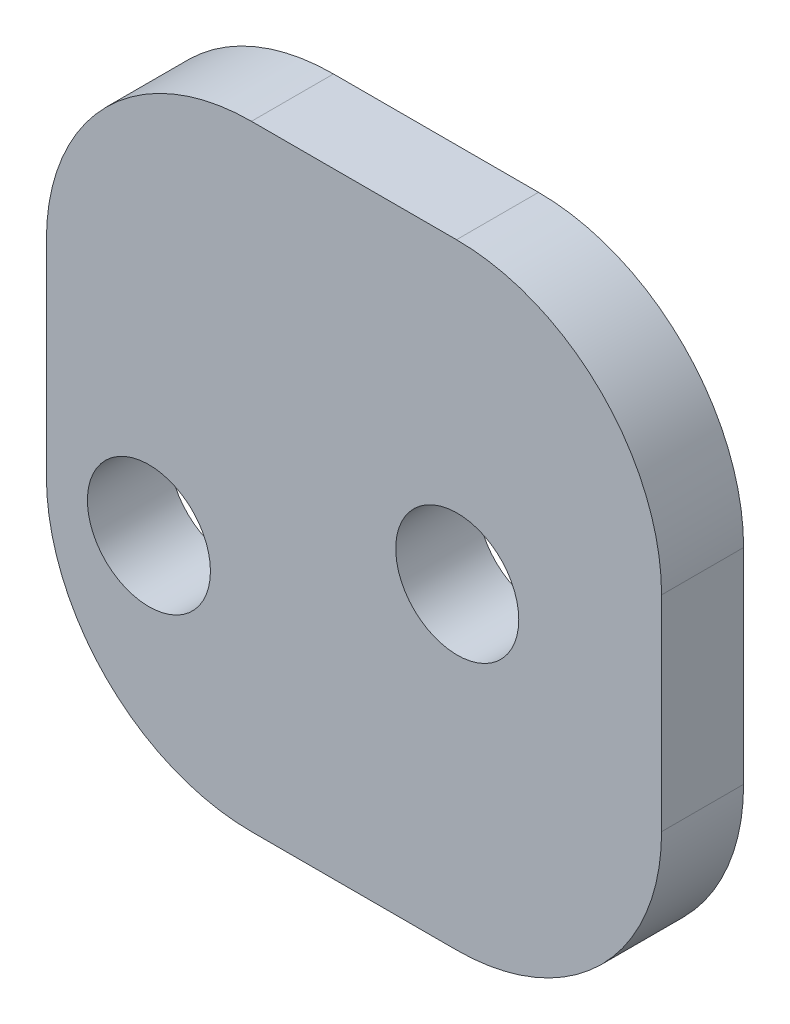
ISO-10303-21;
HEADER;
FILE_DESCRIPTION(('STEP AP214'),'2;1');
FILE_NAME('part.step','',(''),(''),'','','');
FILE_SCHEMA(('AUTOMOTIVE_DESIGN { 1 0 10303 214 1 1 1 1 }'));
ENDSEC;
DATA;
#1=APPLICATION_CONTEXT('core data for automotive mechanical design processes');
#2=APPLICATION_PROTOCOL_DEFINITION('international standard','automotive_design',2000,#1);
#3=PRODUCT_CONTEXT('',#1,'mechanical');
#4=PRODUCT('Part','Part','',(#3));
#5=PRODUCT_RELATED_PRODUCT_CATEGORY('part','',(#4));
#6=PRODUCT_DEFINITION_FORMATION('','',#4);
#7=PRODUCT_DEFINITION_CONTEXT('part definition',#1,'design');
#8=PRODUCT_DEFINITION('design','',#6,#7);
#9=PRODUCT_DEFINITION_SHAPE('','',#8);
#10=(LENGTH_UNIT() NAMED_UNIT(*) SI_UNIT(.MILLI.,.METRE.));
#11=(NAMED_UNIT(*) PLANE_ANGLE_UNIT() SI_UNIT($,.RADIAN.));
#12=(NAMED_UNIT(*) SI_UNIT($,.STERADIAN.) SOLID_ANGLE_UNIT());
#13=UNCERTAINTY_MEASURE_WITH_UNIT(LENGTH_MEASURE(1.E-05),#10,'distance_accuracy_value','');
#14=(GEOMETRIC_REPRESENTATION_CONTEXT(3) GLOBAL_UNCERTAINTY_ASSIGNED_CONTEXT((#13)) GLOBAL_UNIT_ASSIGNED_CONTEXT((#10,
#11,#12)) REPRESENTATION_CONTEXT('',''));
#15=CARTESIAN_POINT('',(0.,0.,0.));
#16=DIRECTION('',(0.,0.,1.));
#17=DIRECTION('',(1.,0.,0.));
#18=AXIS2_PLACEMENT_3D('',#15,#16,#17);
#19=CARTESIAN_POINT('',(-20.,7.5,2.));
#20=DIRECTION('',(0.,-1.,0.));
#21=DIRECTION('',(0.,0.,-1.));
#22=AXIS2_PLACEMENT_3D('',#19,#20,#21);
#23=PLANE('',#22);
#24=DIRECTION('',(-1.,0.,0.));
#25=VECTOR('',#24,1.);
#26=CARTESIAN_POINT('',(-20.,7.5,2.));
#27=LINE('',#26,#25);
#28=CARTESIAN_POINT('',(-10.,7.5,2.));
#29=VERTEX_POINT('',#28);
#30=CARTESIAN_POINT('',(-15.,7.5,2.));
#31=VERTEX_POINT('',#30);
#32=EDGE_CURVE('E128',#29,#31,#27,.T.);
#33=ORIENTED_EDGE('',*,*,#32,.F.);
#34=DIRECTION('',(0.,0.,1.));
#35=VECTOR('',#34,1.);
#36=CARTESIAN_POINT('',(-10.,7.5,2.));
#37=LINE('',#36,#35);
#38=CARTESIAN_POINT('',(-10.,7.5,0.));
#39=VERTEX_POINT('',#38);
#40=EDGE_CURVE('E11',#29,#39,#37,.F.);
#41=ORIENTED_EDGE('',*,*,#40,.T.);
#42=DIRECTION('',(-1.,0.,0.));
#43=VECTOR('',#42,1.);
#44=CARTESIAN_POINT('',(-20.,7.5,0.));
#45=LINE('',#44,#43);
#46=CARTESIAN_POINT('',(-15.,7.5,0.));
#47=VERTEX_POINT('',#46);
#48=EDGE_CURVE('E133',#39,#47,#45,.T.);
#49=ORIENTED_EDGE('',*,*,#48,.T.);
#50=DIRECTION('',(0.,0.,-1.));
#51=VECTOR('',#50,1.);
#52=CARTESIAN_POINT('',(-15.,7.5,2.));
#53=LINE('',#52,#51);
#54=EDGE_CURVE('E42',#47,#31,#53,.F.);
#55=ORIENTED_EDGE('',*,*,#54,.T.);
#56=EDGE_LOOP('',(#33,#41,#49,#55));
#57=FACE_BOUND('',#56,.T.);
#58=ADVANCED_FACE('F34',(#57),#23,.F.);
#59=CARTESIAN_POINT('',(-20.,-7.5,2.));
#60=DIRECTION('',(1.,0.,0.));
#61=DIRECTION('',(0.,0.,-1.));
#62=AXIS2_PLACEMENT_3D('',#59,#60,#61);
#63=PLANE('',#62);
#64=DIRECTION('',(0.,-1.,0.));
#65=VECTOR('',#64,1.);
#66=CARTESIAN_POINT('',(-20.,-7.5,0.));
#67=LINE('',#66,#65);
#68=CARTESIAN_POINT('',(-20.,2.5,0.));
#69=VERTEX_POINT('',#68);
#70=CARTESIAN_POINT('',(-20.,-2.5,0.));
#71=VERTEX_POINT('',#70);
#72=EDGE_CURVE('E129',#69,#71,#67,.T.);
#73=ORIENTED_EDGE('',*,*,#72,.T.);
#74=DIRECTION('',(0.,0.,-1.));
#75=VECTOR('',#74,1.);
#76=CARTESIAN_POINT('',(-20.,-2.5,2.));
#77=LINE('',#76,#75);
#78=CARTESIAN_POINT('',(-20.,-2.5,2.));
#79=VERTEX_POINT('',#78);
#80=EDGE_CURVE('E103',#71,#79,#77,.F.);
#81=ORIENTED_EDGE('',*,*,#80,.T.);
#82=DIRECTION('',(0.,-1.,0.));
#83=VECTOR('',#82,1.);
#84=CARTESIAN_POINT('',(-20.,-7.5,2.));
#85=LINE('',#84,#83);
#86=CARTESIAN_POINT('',(-20.,2.5,2.));
#87=VERTEX_POINT('',#86);
#88=EDGE_CURVE('E131',#87,#79,#85,.T.);
#89=ORIENTED_EDGE('',*,*,#88,.F.);
#90=DIRECTION('',(0.,0.,-1.));
#91=VECTOR('',#90,1.);
#92=CARTESIAN_POINT('',(-20.,2.5,2.));
#93=LINE('',#92,#91);
#94=EDGE_CURVE('E108',#87,#69,#93,.T.);
#95=ORIENTED_EDGE('',*,*,#94,.T.);
#96=EDGE_LOOP('',(#73,#81,#89,#95));
#97=FACE_BOUND('',#96,.T.);
#98=ADVANCED_FACE('F190',(#97),#63,.F.);
#99=CARTESIAN_POINT('',(-20.,-7.5,2.));
#100=DIRECTION('',(0.,1.,0.));
#101=DIRECTION('',(0.,0.,1.));
#102=AXIS2_PLACEMENT_3D('',#99,#100,#101);
#103=PLANE('',#102);
#104=DIRECTION('',(1.,0.,0.));
#105=VECTOR('',#104,1.);
#106=CARTESIAN_POINT('',(-20.,-7.5,2.));
#107=LINE('',#106,#105);
#108=CARTESIAN_POINT('',(-15.,-7.5,2.));
#109=VERTEX_POINT('',#108);
#110=CARTESIAN_POINT('',(-10.,-7.5,2.));
#111=VERTEX_POINT('',#110);
#112=EDGE_CURVE('E119',#109,#111,#107,.T.);
#113=ORIENTED_EDGE('',*,*,#112,.F.);
#114=DIRECTION('',(0.,0.,-1.));
#115=VECTOR('',#114,1.);
#116=CARTESIAN_POINT('',(-15.,-7.5,2.));
#117=LINE('',#116,#115);
#118=CARTESIAN_POINT('',(-15.,-7.5,0.));
#119=VERTEX_POINT('',#118);
#120=EDGE_CURVE('E102',#109,#119,#117,.T.);
#121=ORIENTED_EDGE('',*,*,#120,.T.);
#122=DIRECTION('',(1.,0.,0.));
#123=VECTOR('',#122,1.);
#124=CARTESIAN_POINT('',(-20.,-7.5,0.));
#125=LINE('',#124,#123);
#126=CARTESIAN_POINT('',(-10.,-7.5,0.));
#127=VERTEX_POINT('',#126);
#128=EDGE_CURVE('E116',#119,#127,#125,.T.);
#129=ORIENTED_EDGE('',*,*,#128,.T.);
#130=DIRECTION('',(0.,0.,1.));
#131=VECTOR('',#130,1.);
#132=CARTESIAN_POINT('',(-10.,-7.5,2.));
#133=LINE('',#132,#131);
#134=EDGE_CURVE('E121',#127,#111,#133,.T.);
#135=ORIENTED_EDGE('',*,*,#134,.T.);
#136=EDGE_LOOP('',(#113,#121,#129,#135));
#137=FACE_BOUND('',#136,.T.);
#138=ADVANCED_FACE('F114',(#137),#103,.F.);
#139=CARTESIAN_POINT('',(0.,0.,2.));
#140=DIRECTION('',(0.,0.,-1.));
#141=DIRECTION('',(-1.,0.,0.));
#142=AXIS2_PLACEMENT_3D('',#139,#140,#141);
#143=PLANE('',#142);
#144=CARTESIAN_POINT('',(-17.5000000000003,-2.50000000003801,2.));
#145=DIRECTION('',(0.,0.,1.));
#146=DIRECTION('',(1.,0.,0.));
#147=AXIS2_PLACEMENT_3D('',#144,#145,#146);
#148=CIRCLE('',#147,1.5);
#149=CARTESIAN_POINT('',(-16.0000000000003,-2.50000000003801,2.));
#150=VERTEX_POINT('',#149);
#151=EDGE_CURVE('E168',#150,#150,#148,.T.);
#152=ORIENTED_EDGE('',*,*,#151,.F.);
#153=EDGE_LOOP('',(#152));
#154=FACE_BOUND('',#153,.T.);
#155=CARTESIAN_POINT('',(-9.98245903371299,0.236161146567329,2.));
#156=DIRECTION('',(0.,0.,1.));
#157=DIRECTION('',(1.,0.,0.));
#158=AXIS2_PLACEMENT_3D('',#155,#156,#157);
#159=CIRCLE('',#158,1.5);
#160=CARTESIAN_POINT('',(-8.48245903371299,0.236161146567329,2.));
#161=VERTEX_POINT('',#160);
#162=EDGE_CURVE('E175',#161,#161,#159,.T.);
#163=ORIENTED_EDGE('',*,*,#162,.F.);
#164=EDGE_LOOP('',(#163));
#165=FACE_BOUND('',#164,.T.);
#166=ORIENTED_EDGE('',*,*,#88,.T.);
#167=CARTESIAN_POINT('',(-15.,-2.5,2.));
#168=DIRECTION('',(0.,0.,-1.));
#169=DIRECTION('',(-1.,0.,0.));
#170=AXIS2_PLACEMENT_3D('',#167,#168,#169);
#171=CIRCLE('',#170,5.);
#172=EDGE_CURVE('E152',#79,#109,#171,.F.);
#173=ORIENTED_EDGE('',*,*,#172,.T.);
#174=ORIENTED_EDGE('',*,*,#112,.T.);
#175=CARTESIAN_POINT('',(-10.,-2.5,2.));
#176=DIRECTION('',(0.,0.,-1.));
#177=DIRECTION('',(-1.,0.,0.));
#178=AXIS2_PLACEMENT_3D('',#175,#176,#177);
#179=CIRCLE('',#178,5.);
#180=CARTESIAN_POINT('',(-5.,-2.5,2.));
#181=VERTEX_POINT('',#180);
#182=EDGE_CURVE('E149',#111,#181,#179,.F.);
#183=ORIENTED_EDGE('',*,*,#182,.T.);
#184=DIRECTION('',(0.,-1.,0.));
#185=VECTOR('',#184,1.);
#186=CARTESIAN_POINT('',(-5.,7.5,2.));
#187=LINE('',#186,#185);
#188=CARTESIAN_POINT('',(-5.,2.5,2.));
#189=VERTEX_POINT('',#188);
#190=EDGE_CURVE('E162',#189,#181,#187,.T.);
#191=ORIENTED_EDGE('',*,*,#190,.F.);
#192=CARTESIAN_POINT('',(-10.,2.5,2.));
#193=DIRECTION('',(0.,0.,-1.));
#194=DIRECTION('',(-1.,0.,0.));
#195=AXIS2_PLACEMENT_3D('',#192,#193,#194);
#196=CIRCLE('',#195,5.);
#197=EDGE_CURVE('E55',#189,#29,#196,.F.);
#198=ORIENTED_EDGE('',*,*,#197,.T.);
#199=ORIENTED_EDGE('',*,*,#32,.T.);
#200=CARTESIAN_POINT('',(-15.,2.5,2.));
#201=DIRECTION('',(0.,0.,-1.));
#202=DIRECTION('',(-1.,0.,0.));
#203=AXIS2_PLACEMENT_3D('',#200,#201,#202);
#204=CIRCLE('',#203,5.);
#205=EDGE_CURVE('E147',#31,#87,#204,.F.);
#206=ORIENTED_EDGE('',*,*,#205,.T.);
#207=EDGE_LOOP('',(#166,#173,#174,#183,#191,#198,#199,#206));
#208=FACE_BOUND('',#207,.T.);
#209=ADVANCED_FACE('F167',(#154,#165,#208),#143,.F.);
#210=CARTESIAN_POINT('',(0.,0.,0.));
#211=DIRECTION('',(0.,0.,-1.));
#212=DIRECTION('',(-1.,0.,0.));
#213=AXIS2_PLACEMENT_3D('',#210,#211,#212);
#214=PLANE('',#213);
#215=ORIENTED_EDGE('',*,*,#128,.F.);
#216=CARTESIAN_POINT('',(-15.,-2.5,0.));
#217=DIRECTION('',(0.,0.,-1.));
#218=DIRECTION('',(-1.,0.,0.));
#219=AXIS2_PLACEMENT_3D('',#216,#217,#218);
#220=CIRCLE('',#219,5.);
#221=EDGE_CURVE('E98',#119,#71,#220,.T.);
#222=ORIENTED_EDGE('',*,*,#221,.T.);
#223=ORIENTED_EDGE('',*,*,#72,.F.);
#224=CARTESIAN_POINT('',(-15.,2.5,0.));
#225=DIRECTION('',(0.,0.,-1.));
#226=DIRECTION('',(-1.,0.,0.));
#227=AXIS2_PLACEMENT_3D('',#224,#225,#226);
#228=CIRCLE('',#227,5.);
#229=EDGE_CURVE('E120',#69,#47,#228,.T.);
#230=ORIENTED_EDGE('',*,*,#229,.T.);
#231=ORIENTED_EDGE('',*,*,#48,.F.);
#232=CARTESIAN_POINT('',(-10.,2.5,0.));
#233=DIRECTION('',(0.,0.,-1.));
#234=DIRECTION('',(-1.,0.,0.));
#235=AXIS2_PLACEMENT_3D('',#232,#233,#234);
#236=CIRCLE('',#235,5.);
#237=CARTESIAN_POINT('',(-5.,2.5,0.));
#238=VERTEX_POINT('',#237);
#239=EDGE_CURVE('E109',#39,#238,#236,.T.);
#240=ORIENTED_EDGE('',*,*,#239,.T.);
#241=DIRECTION('',(0.,1.,0.));
#242=VECTOR('',#241,1.);
#243=CARTESIAN_POINT('',(-5.,0.,0.));
#244=LINE('',#243,#242);
#245=CARTESIAN_POINT('',(-5.,-2.5,0.));
#246=VERTEX_POINT('',#245);
#247=EDGE_CURVE('E137',#246,#238,#244,.T.);
#248=ORIENTED_EDGE('',*,*,#247,.F.);
#249=CARTESIAN_POINT('',(-10.,-2.5,0.));
#250=DIRECTION('',(0.,0.,-1.));
#251=DIRECTION('',(-1.,0.,0.));
#252=AXIS2_PLACEMENT_3D('',#249,#250,#251);
#253=CIRCLE('',#252,5.);
#254=EDGE_CURVE('E127',#246,#127,#253,.T.);
#255=ORIENTED_EDGE('',*,*,#254,.T.);
#256=EDGE_LOOP('',(#215,#222,#223,#230,#231,#240,#248,#255));
#257=FACE_BOUND('',#256,.T.);
#258=CARTESIAN_POINT('',(-17.5000000000003,-2.50000000003801,0.));
#259=DIRECTION('',(0.,0.,1.));
#260=DIRECTION('',(1.,0.,0.));
#261=AXIS2_PLACEMENT_3D('',#258,#259,#260);
#262=CIRCLE('',#261,1.5);
#263=CARTESIAN_POINT('',(-16.0000000000003,-2.50000000003801,0.));
#264=VERTEX_POINT('',#263);
#265=EDGE_CURVE('E171',#264,#264,#262,.T.);
#266=ORIENTED_EDGE('',*,*,#265,.T.);
#267=EDGE_LOOP('',(#266));
#268=FACE_BOUND('',#267,.T.);
#269=CARTESIAN_POINT('',(-9.98245903371299,0.236161146567329,0.));
#270=DIRECTION('',(0.,0.,1.));
#271=DIRECTION('',(1.,0.,0.));
#272=AXIS2_PLACEMENT_3D('',#269,#270,#271);
#273=CIRCLE('',#272,1.5);
#274=CARTESIAN_POINT('',(-8.48245903371299,0.236161146567329,0.));
#275=VERTEX_POINT('',#274);
#276=EDGE_CURVE('E177',#275,#275,#273,.T.);
#277=ORIENTED_EDGE('',*,*,#276,.T.);
#278=EDGE_LOOP('',(#277));
#279=FACE_BOUND('',#278,.T.);
#280=ADVANCED_FACE('F123',(#257,#268,#279),#214,.T.);
#281=CARTESIAN_POINT('',(-9.98245903371299,0.236161146567329,0.));
#282=DIRECTION('',(0.,0.,1.));
#283=DIRECTION('',(1.,0.,0.));
#284=AXIS2_PLACEMENT_3D('',#281,#282,#283);
#285=CYLINDRICAL_SURFACE('',#284,1.5);
#286=ORIENTED_EDGE('',*,*,#276,.F.);
#287=EDGE_LOOP('',(#286));
#288=FACE_BOUND('',#287,.T.);
#289=ORIENTED_EDGE('',*,*,#162,.T.);
#290=EDGE_LOOP('',(#289));
#291=FACE_BOUND('',#290,.T.);
#292=ADVANCED_FACE('F249',(#288,#291),#285,.F.);
#293=CARTESIAN_POINT('',(-17.5000000000003,-2.50000000003801,0.));
#294=DIRECTION('',(0.,0.,1.));
#295=DIRECTION('',(1.,0.,0.));
#296=AXIS2_PLACEMENT_3D('',#293,#294,#295);
#297=CYLINDRICAL_SURFACE('',#296,1.5);
#298=ORIENTED_EDGE('',*,*,#265,.F.);
#299=EDGE_LOOP('',(#298));
#300=FACE_BOUND('',#299,.T.);
#301=ORIENTED_EDGE('',*,*,#151,.T.);
#302=EDGE_LOOP('',(#301));
#303=FACE_BOUND('',#302,.T.);
#304=ADVANCED_FACE('F238',(#300,#303),#297,.F.);
#305=CARTESIAN_POINT('',(-5.,7.5,-8.));
#306=DIRECTION('',(-1.,0.,0.));
#307=DIRECTION('',(0.,-1.,0.));
#308=AXIS2_PLACEMENT_3D('',#305,#306,#307);
#309=PLANE('',#308);
#310=ORIENTED_EDGE('',*,*,#247,.T.);
#311=DIRECTION('',(0.,0.,1.));
#312=VECTOR('',#311,1.);
#313=CARTESIAN_POINT('',(-5.,2.5,-8.));
#314=LINE('',#313,#312);
#315=EDGE_CURVE('E156',#238,#189,#314,.T.);
#316=ORIENTED_EDGE('',*,*,#315,.T.);
#317=ORIENTED_EDGE('',*,*,#190,.T.);
#318=DIRECTION('',(0.,0.,1.));
#319=VECTOR('',#318,1.);
#320=CARTESIAN_POINT('',(-5.,-2.5,-8.));
#321=LINE('',#320,#319);
#322=EDGE_CURVE('E154',#181,#246,#321,.F.);
#323=ORIENTED_EDGE('',*,*,#322,.T.);
#324=EDGE_LOOP('',(#310,#316,#317,#323));
#325=FACE_BOUND('',#324,.T.);
#326=ADVANCED_FACE('F161',(#325),#309,.F.);
#327=CARTESIAN_POINT('',(-15.,-2.5,2.));
#328=DIRECTION('',(0.,0.,-1.));
#329=DIRECTION('',(-1.,0.,0.));
#330=AXIS2_PLACEMENT_3D('',#327,#328,#329);
#331=CYLINDRICAL_SURFACE('',#330,5.);
#332=ORIENTED_EDGE('',*,*,#172,.F.);
#333=ORIENTED_EDGE('',*,*,#80,.F.);
#334=ORIENTED_EDGE('',*,*,#221,.F.);
#335=ORIENTED_EDGE('',*,*,#120,.F.);
#336=EDGE_LOOP('',(#332,#333,#334,#335));
#337=FACE_BOUND('',#336,.T.);
#338=ADVANCED_FACE('F101',(#337),#331,.T.);
#339=CARTESIAN_POINT('',(-10.,2.5,-8.));
#340=DIRECTION('',(0.,0.,1.));
#341=DIRECTION('',(1.,0.,0.));
#342=AXIS2_PLACEMENT_3D('',#339,#340,#341);
#343=CYLINDRICAL_SURFACE('',#342,5.);
#344=ORIENTED_EDGE('',*,*,#239,.F.);
#345=ORIENTED_EDGE('',*,*,#40,.F.);
#346=ORIENTED_EDGE('',*,*,#197,.F.);
#347=ORIENTED_EDGE('',*,*,#315,.F.);
#348=EDGE_LOOP('',(#344,#345,#346,#347));
#349=FACE_BOUND('',#348,.T.);
#350=ADVANCED_FACE('F203',(#349),#343,.T.);
#351=CARTESIAN_POINT('',(-10.,-2.5,2.));
#352=DIRECTION('',(0.,0.,1.));
#353=DIRECTION('',(1.,0.,0.));
#354=AXIS2_PLACEMENT_3D('',#351,#352,#353);
#355=CYLINDRICAL_SURFACE('',#354,5.);
#356=ORIENTED_EDGE('',*,*,#254,.F.);
#357=ORIENTED_EDGE('',*,*,#322,.F.);
#358=ORIENTED_EDGE('',*,*,#182,.F.);
#359=ORIENTED_EDGE('',*,*,#134,.F.);
#360=EDGE_LOOP('',(#356,#357,#358,#359));
#361=FACE_BOUND('',#360,.T.);
#362=ADVANCED_FACE('F205',(#361),#355,.T.);
#363=CARTESIAN_POINT('',(-15.,2.5,2.));
#364=DIRECTION('',(0.,0.,-1.));
#365=DIRECTION('',(-1.,0.,0.));
#366=AXIS2_PLACEMENT_3D('',#363,#364,#365);
#367=CYLINDRICAL_SURFACE('',#366,5.);
#368=ORIENTED_EDGE('',*,*,#205,.F.);
#369=ORIENTED_EDGE('',*,*,#54,.F.);
#370=ORIENTED_EDGE('',*,*,#229,.F.);
#371=ORIENTED_EDGE('',*,*,#94,.F.);
#372=EDGE_LOOP('',(#368,#369,#370,#371));
#373=FACE_BOUND('',#372,.T.);
#374=ADVANCED_FACE('F36',(#373),#367,.T.);
#375=CLOSED_SHELL('',(#58,#98,#138,#209,#280,#292,#304,#326,#338,#350,#362,#374));
#376=MANIFOLD_SOLID_BREP('B2',#375);
#377=ADVANCED_BREP_SHAPE_REPRESENTATION('',(#18,#376),#14);
#378=SHAPE_DEFINITION_REPRESENTATION(#9,#377);
ENDSEC;
END-ISO-10303-21;
